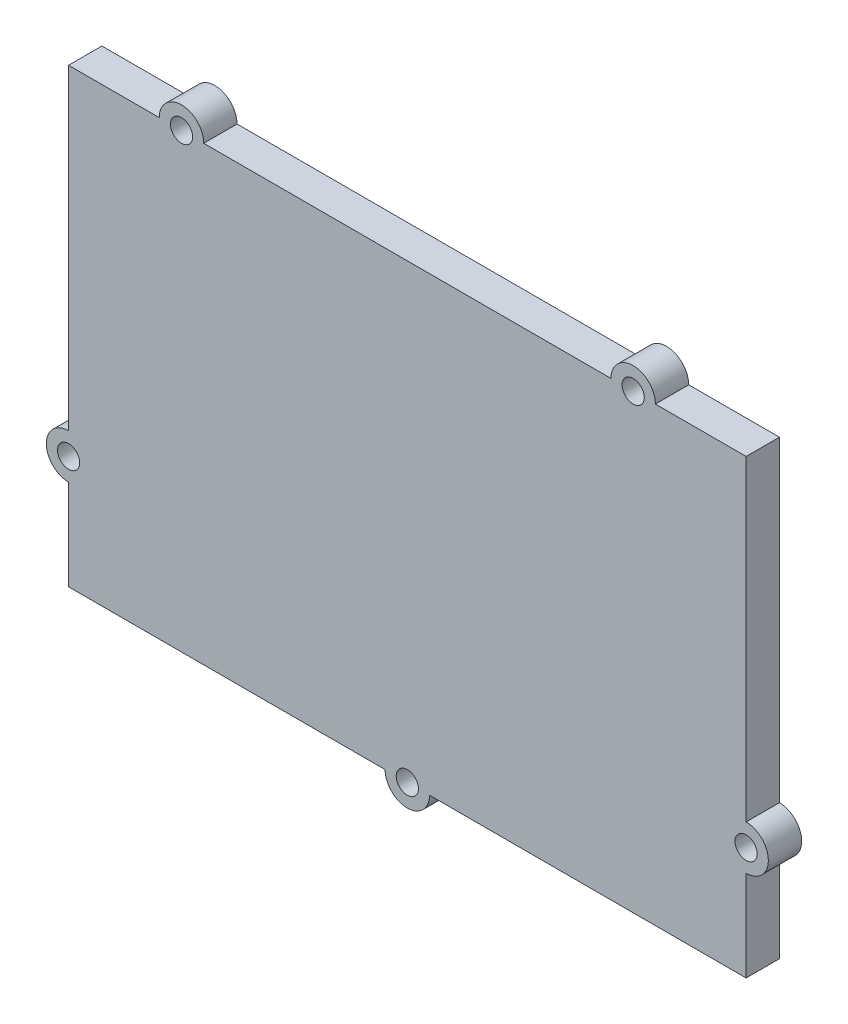
ISO-10303-21;
HEADER;
FILE_DESCRIPTION(('STEP AP214'),'2;1');
FILE_NAME('part.step','',(''),(''),'','','');
FILE_SCHEMA(('AUTOMOTIVE_DESIGN { 1 0 10303 214 1 1 1 1 }'));
ENDSEC;
DATA;
#1=APPLICATION_CONTEXT('core data for automotive mechanical design processes');
#2=APPLICATION_PROTOCOL_DEFINITION('international standard','automotive_design',2000,#1);
#3=PRODUCT_CONTEXT('',#1,'mechanical');
#4=PRODUCT('Part','Part','',(#3));
#5=PRODUCT_RELATED_PRODUCT_CATEGORY('part','',(#4));
#6=PRODUCT_DEFINITION_FORMATION('','',#4);
#7=PRODUCT_DEFINITION_CONTEXT('part definition',#1,'design');
#8=PRODUCT_DEFINITION('design','',#6,#7);
#9=PRODUCT_DEFINITION_SHAPE('','',#8);
#10=(LENGTH_UNIT() NAMED_UNIT(*) SI_UNIT(.MILLI.,.METRE.));
#11=(NAMED_UNIT(*) PLANE_ANGLE_UNIT() SI_UNIT($,.RADIAN.));
#12=(NAMED_UNIT(*) SI_UNIT($,.STERADIAN.) SOLID_ANGLE_UNIT());
#13=UNCERTAINTY_MEASURE_WITH_UNIT(LENGTH_MEASURE(1.E-05),#10,'distance_accuracy_value','');
#14=(GEOMETRIC_REPRESENTATION_CONTEXT(3) GLOBAL_UNCERTAINTY_ASSIGNED_CONTEXT((#13)) GLOBAL_UNIT_ASSIGNED_CONTEXT((#10,
#11,#12)) REPRESENTATION_CONTEXT('',''));
#15=CARTESIAN_POINT('',(0.,0.,0.));
#16=DIRECTION('',(0.,0.,1.));
#17=DIRECTION('',(1.,0.,0.));
#18=AXIS2_PLACEMENT_3D('',#15,#16,#17);
#19=CARTESIAN_POINT('',(30.48,0.,3.));
#20=DIRECTION('',(-1.,0.,0.));
#21=DIRECTION('',(0.,-1.,0.));
#22=AXIS2_PLACEMENT_3D('',#19,#20,#21);
#23=PLANE('',#22);
#24=DIRECTION('',(0.,1.,0.));
#25=VECTOR('',#24,1.);
#26=CARTESIAN_POINT('',(30.48,0.,0.));
#27=LINE('',#26,#25);
#28=CARTESIAN_POINT('',(30.48,-20.32,0.));
#29=VERTEX_POINT('',#28);
#30=CARTESIAN_POINT('',(30.48,-12.16,0.));
#31=VERTEX_POINT('',#30);
#32=EDGE_CURVE('E198',#29,#31,#27,.T.);
#33=ORIENTED_EDGE('',*,*,#32,.T.);
#34=DIRECTION('',(0.,0.,-1.));
#35=VECTOR('',#34,1.);
#36=CARTESIAN_POINT('',(30.48,-12.16,3.));
#37=LINE('',#36,#35);
#38=CARTESIAN_POINT('',(30.48,-12.16,3.));
#39=VERTEX_POINT('',#38);
#40=EDGE_CURVE('E11',#39,#31,#37,.T.);
#41=ORIENTED_EDGE('',*,*,#40,.F.);
#42=DIRECTION('',(0.,1.,0.));
#43=VECTOR('',#42,1.);
#44=CARTESIAN_POINT('',(30.48,0.,3.));
#45=LINE('',#44,#43);
#46=CARTESIAN_POINT('',(30.48,-20.32,3.));
#47=VERTEX_POINT('',#46);
#48=EDGE_CURVE('E331',#47,#39,#45,.T.);
#49=ORIENTED_EDGE('',*,*,#48,.F.);
#50=DIRECTION('',(0.,0.,-1.));
#51=VECTOR('',#50,1.);
#52=CARTESIAN_POINT('',(30.48,-20.32,3.));
#53=LINE('',#52,#51);
#54=EDGE_CURVE('E174',#47,#29,#53,.T.);
#55=ORIENTED_EDGE('',*,*,#54,.T.);
#56=EDGE_LOOP('',(#33,#41,#49,#55));
#57=FACE_BOUND('',#56,.T.);
#58=ADVANCED_FACE('F41',(#57),#23,.F.);
#59=CARTESIAN_POINT('',(30.48,-10.16,3.));
#60=DIRECTION('',(0.,0.,-1.));
#61=DIRECTION('',(-1.,0.,0.));
#62=AXIS2_PLACEMENT_3D('',#59,#60,#61);
#63=CYLINDRICAL_SURFACE('',#62,2.);
#64=CARTESIAN_POINT('',(30.48,-10.16,0.));
#65=DIRECTION('',(0.,0.,1.));
#66=DIRECTION('',(1.,0.,0.));
#67=AXIS2_PLACEMENT_3D('',#64,#65,#66);
#68=CIRCLE('',#67,2.);
#69=CARTESIAN_POINT('',(30.48,-8.16,0.));
#70=VERTEX_POINT('',#69);
#71=EDGE_CURVE('E202',#31,#70,#68,.T.);
#72=ORIENTED_EDGE('',*,*,#71,.T.);
#73=DIRECTION('',(0.,0.,-1.));
#74=VECTOR('',#73,1.);
#75=CARTESIAN_POINT('',(30.48,-8.16,3.));
#76=LINE('',#75,#74);
#77=CARTESIAN_POINT('',(30.48,-8.16,3.));
#78=VERTEX_POINT('',#77);
#79=EDGE_CURVE('E51',#78,#70,#76,.T.);
#80=ORIENTED_EDGE('',*,*,#79,.F.);
#81=CARTESIAN_POINT('',(30.48,-10.16,3.));
#82=DIRECTION('',(0.,0.,1.));
#83=DIRECTION('',(1.,0.,0.));
#84=AXIS2_PLACEMENT_3D('',#81,#82,#83);
#85=CIRCLE('',#84,2.);
#86=EDGE_CURVE('E120',#39,#78,#85,.T.);
#87=ORIENTED_EDGE('',*,*,#86,.F.);
#88=ORIENTED_EDGE('',*,*,#40,.T.);
#89=EDGE_LOOP('',(#72,#80,#87,#88));
#90=FACE_BOUND('',#89,.T.);
#91=ADVANCED_FACE('F346',(#90),#63,.T.);
#92=CARTESIAN_POINT('',(30.48,0.,3.));
#93=DIRECTION('',(-1.,0.,0.));
#94=DIRECTION('',(0.,-1.,0.));
#95=AXIS2_PLACEMENT_3D('',#92,#93,#94);
#96=PLANE('',#95);
#97=DIRECTION('',(0.,1.,0.));
#98=VECTOR('',#97,1.);
#99=CARTESIAN_POINT('',(30.48,0.,0.));
#100=LINE('',#99,#98);
#101=CARTESIAN_POINT('',(30.48,20.32,0.));
#102=VERTEX_POINT('',#101);
#103=EDGE_CURVE('E205',#70,#102,#100,.T.);
#104=ORIENTED_EDGE('',*,*,#103,.T.);
#105=DIRECTION('',(0.,0.,-1.));
#106=VECTOR('',#105,1.);
#107=CARTESIAN_POINT('',(30.48,20.32,3.));
#108=LINE('',#107,#106);
#109=CARTESIAN_POINT('',(30.48,20.32,3.));
#110=VERTEX_POINT('',#109);
#111=EDGE_CURVE('E275',#110,#102,#108,.T.);
#112=ORIENTED_EDGE('',*,*,#111,.F.);
#113=DIRECTION('',(0.,1.,0.));
#114=VECTOR('',#113,1.);
#115=CARTESIAN_POINT('',(30.48,0.,3.));
#116=LINE('',#115,#114);
#117=EDGE_CURVE('E284',#78,#110,#116,.T.);
#118=ORIENTED_EDGE('',*,*,#117,.F.);
#119=ORIENTED_EDGE('',*,*,#79,.T.);
#120=EDGE_LOOP('',(#104,#112,#118,#119));
#121=FACE_BOUND('',#120,.T.);
#122=ADVANCED_FACE('F282',(#121),#96,.F.);
#123=CARTESIAN_POINT('',(0.,20.32,3.));
#124=DIRECTION('',(0.,1.,0.));
#125=DIRECTION('',(0.,0.,1.));
#126=AXIS2_PLACEMENT_3D('',#123,#124,#125);
#127=PLANE('',#126);
#128=DIRECTION('',(1.,0.,0.));
#129=VECTOR('',#128,1.);
#130=CARTESIAN_POINT('',(0.,20.32,0.));
#131=LINE('',#130,#129);
#132=CARTESIAN_POINT('',(22.32,20.32,0.));
#133=VERTEX_POINT('',#132);
#134=EDGE_CURVE('E209',#133,#102,#131,.T.);
#135=ORIENTED_EDGE('',*,*,#134,.F.);
#136=DIRECTION('',(0.,0.,-1.));
#137=VECTOR('',#136,1.);
#138=CARTESIAN_POINT('',(22.32,20.32,3.));
#139=LINE('',#138,#137);
#140=CARTESIAN_POINT('',(22.32,20.32,3.));
#141=VERTEX_POINT('',#140);
#142=EDGE_CURVE('E272',#141,#133,#139,.T.);
#143=ORIENTED_EDGE('',*,*,#142,.F.);
#144=DIRECTION('',(1.,0.,0.));
#145=VECTOR('',#144,1.);
#146=CARTESIAN_POINT('',(0.,20.32,3.));
#147=LINE('',#146,#145);
#148=EDGE_CURVE('E295',#141,#110,#147,.T.);
#149=ORIENTED_EDGE('',*,*,#148,.T.);
#150=ORIENTED_EDGE('',*,*,#111,.T.);
#151=EDGE_LOOP('',(#135,#143,#149,#150));
#152=FACE_BOUND('',#151,.T.);
#153=ADVANCED_FACE('F291',(#152),#127,.T.);
#154=CARTESIAN_POINT('',(20.32,20.32,3.));
#155=DIRECTION('',(0.,0.,-1.));
#156=DIRECTION('',(-1.,0.,0.));
#157=AXIS2_PLACEMENT_3D('',#154,#155,#156);
#158=CYLINDRICAL_SURFACE('',#157,2.);
#159=CARTESIAN_POINT('',(20.32,20.32,0.));
#160=DIRECTION('',(0.,0.,1.));
#161=DIRECTION('',(1.,0.,0.));
#162=AXIS2_PLACEMENT_3D('',#159,#160,#161);
#163=CIRCLE('',#162,2.);
#164=CARTESIAN_POINT('',(18.32,20.32,0.));
#165=VERTEX_POINT('',#164);
#166=EDGE_CURVE('E213',#133,#165,#163,.T.);
#167=ORIENTED_EDGE('',*,*,#166,.T.);
#168=DIRECTION('',(0.,0.,-1.));
#169=VECTOR('',#168,1.);
#170=CARTESIAN_POINT('',(18.32,20.32,3.));
#171=LINE('',#170,#169);
#172=CARTESIAN_POINT('',(18.32,20.32,3.));
#173=VERTEX_POINT('',#172);
#174=EDGE_CURVE('E269',#173,#165,#171,.T.);
#175=ORIENTED_EDGE('',*,*,#174,.F.);
#176=CARTESIAN_POINT('',(20.32,20.32,3.));
#177=DIRECTION('',(0.,0.,1.));
#178=DIRECTION('',(1.,0.,0.));
#179=AXIS2_PLACEMENT_3D('',#176,#177,#178);
#180=CIRCLE('',#179,2.);
#181=EDGE_CURVE('E297',#141,#173,#180,.T.);
#182=ORIENTED_EDGE('',*,*,#181,.F.);
#183=ORIENTED_EDGE('',*,*,#142,.T.);
#184=EDGE_LOOP('',(#167,#175,#182,#183));
#185=FACE_BOUND('',#184,.T.);
#186=ADVANCED_FACE('F502',(#185),#158,.T.);
#187=CARTESIAN_POINT('',(0.,20.32,3.));
#188=DIRECTION('',(0.,1.,0.));
#189=DIRECTION('',(-1.,0.,0.));
#190=AXIS2_PLACEMENT_3D('',#187,#188,#189);
#191=PLANE('',#190);
#192=DIRECTION('',(1.,0.,0.));
#193=VECTOR('',#192,1.);
#194=CARTESIAN_POINT('',(0.,20.32,0.));
#195=LINE('',#194,#193);
#196=CARTESIAN_POINT('',(-18.32,20.32,0.));
#197=VERTEX_POINT('',#196);
#198=EDGE_CURVE('E217',#197,#165,#195,.T.);
#199=ORIENTED_EDGE('',*,*,#198,.F.);
#200=DIRECTION('',(0.,0.,-1.));
#201=VECTOR('',#200,1.);
#202=CARTESIAN_POINT('',(-18.32,20.32,3.));
#203=LINE('',#202,#201);
#204=CARTESIAN_POINT('',(-18.32,20.32,3.));
#205=VERTEX_POINT('',#204);
#206=EDGE_CURVE('E266',#205,#197,#203,.T.);
#207=ORIENTED_EDGE('',*,*,#206,.F.);
#208=DIRECTION('',(1.,0.,0.));
#209=VECTOR('',#208,1.);
#210=CARTESIAN_POINT('',(0.,20.32,3.));
#211=LINE('',#210,#209);
#212=EDGE_CURVE('E301',#205,#173,#211,.T.);
#213=ORIENTED_EDGE('',*,*,#212,.T.);
#214=ORIENTED_EDGE('',*,*,#174,.T.);
#215=EDGE_LOOP('',(#199,#207,#213,#214));
#216=FACE_BOUND('',#215,.T.);
#217=ADVANCED_FACE('F492',(#216),#191,.T.);
#218=CARTESIAN_POINT('',(-20.32,20.32,3.));
#219=DIRECTION('',(0.,0.,-1.));
#220=DIRECTION('',(-1.,0.,0.));
#221=AXIS2_PLACEMENT_3D('',#218,#219,#220);
#222=CYLINDRICAL_SURFACE('',#221,2.);
#223=CARTESIAN_POINT('',(-20.32,20.32,0.));
#224=DIRECTION('',(0.,0.,1.));
#225=DIRECTION('',(1.,0.,0.));
#226=AXIS2_PLACEMENT_3D('',#223,#224,#225);
#227=CIRCLE('',#226,2.);
#228=CARTESIAN_POINT('',(-22.32,20.32,0.));
#229=VERTEX_POINT('',#228);
#230=EDGE_CURVE('E221',#197,#229,#227,.T.);
#231=ORIENTED_EDGE('',*,*,#230,.T.);
#232=DIRECTION('',(0.,0.,-1.));
#233=VECTOR('',#232,1.);
#234=CARTESIAN_POINT('',(-22.32,20.32,3.));
#235=LINE('',#234,#233);
#236=CARTESIAN_POINT('',(-22.32,20.32,3.));
#237=VERTEX_POINT('',#236);
#238=EDGE_CURVE('E263',#237,#229,#235,.T.);
#239=ORIENTED_EDGE('',*,*,#238,.F.);
#240=CARTESIAN_POINT('',(-20.32,20.32,3.));
#241=DIRECTION('',(0.,0.,1.));
#242=DIRECTION('',(1.,0.,0.));
#243=AXIS2_PLACEMENT_3D('',#240,#241,#242);
#244=CIRCLE('',#243,2.);
#245=EDGE_CURVE('E309',#205,#237,#244,.T.);
#246=ORIENTED_EDGE('',*,*,#245,.F.);
#247=ORIENTED_EDGE('',*,*,#206,.T.);
#248=EDGE_LOOP('',(#231,#239,#246,#247));
#249=FACE_BOUND('',#248,.T.);
#250=ADVANCED_FACE('F482',(#249),#222,.T.);
#251=CARTESIAN_POINT('',(0.,20.32,3.));
#252=DIRECTION('',(0.,1.,0.));
#253=DIRECTION('',(0.,0.,1.));
#254=AXIS2_PLACEMENT_3D('',#251,#252,#253);
#255=PLANE('',#254);
#256=DIRECTION('',(1.,0.,0.));
#257=VECTOR('',#256,1.);
#258=CARTESIAN_POINT('',(0.,20.32,0.));
#259=LINE('',#258,#257);
#260=CARTESIAN_POINT('',(-30.48,20.32,0.));
#261=VERTEX_POINT('',#260);
#262=EDGE_CURVE('E225',#261,#229,#259,.T.);
#263=ORIENTED_EDGE('',*,*,#262,.F.);
#264=DIRECTION('',(0.,0.,-1.));
#265=VECTOR('',#264,1.);
#266=CARTESIAN_POINT('',(-30.48,20.32,3.));
#267=LINE('',#266,#265);
#268=CARTESIAN_POINT('',(-30.48,20.32,3.));
#269=VERTEX_POINT('',#268);
#270=EDGE_CURVE('E260',#269,#261,#267,.T.);
#271=ORIENTED_EDGE('',*,*,#270,.F.);
#272=DIRECTION('',(1.,0.,0.));
#273=VECTOR('',#272,1.);
#274=CARTESIAN_POINT('',(0.,20.32,3.));
#275=LINE('',#274,#273);
#276=EDGE_CURVE('E312',#269,#237,#275,.T.);
#277=ORIENTED_EDGE('',*,*,#276,.T.);
#278=ORIENTED_EDGE('',*,*,#238,.T.);
#279=EDGE_LOOP('',(#263,#271,#277,#278));
#280=FACE_BOUND('',#279,.T.);
#281=ADVANCED_FACE('F472',(#280),#255,.T.);
#282=CARTESIAN_POINT('',(-30.48,0.,3.));
#283=DIRECTION('',(-1.,0.,0.));
#284=DIRECTION('',(0.,0.,1.));
#285=AXIS2_PLACEMENT_3D('',#282,#283,#284);
#286=PLANE('',#285);
#287=DIRECTION('',(0.,1.,0.));
#288=VECTOR('',#287,1.);
#289=CARTESIAN_POINT('',(-30.48,0.,0.));
#290=LINE('',#289,#288);
#291=CARTESIAN_POINT('',(-30.48,-8.16,0.));
#292=VERTEX_POINT('',#291);
#293=EDGE_CURVE('E229',#292,#261,#290,.T.);
#294=ORIENTED_EDGE('',*,*,#293,.F.);
#295=DIRECTION('',(0.,0.,-1.));
#296=VECTOR('',#295,1.);
#297=CARTESIAN_POINT('',(-30.48,-8.16,3.));
#298=LINE('',#297,#296);
#299=CARTESIAN_POINT('',(-30.48,-8.16,3.));
#300=VERTEX_POINT('',#299);
#301=EDGE_CURVE('E257',#300,#292,#298,.T.);
#302=ORIENTED_EDGE('',*,*,#301,.F.);
#303=DIRECTION('',(0.,1.,0.));
#304=VECTOR('',#303,1.);
#305=CARTESIAN_POINT('',(-30.48,0.,3.));
#306=LINE('',#305,#304);
#307=EDGE_CURVE('E316',#300,#269,#306,.T.);
#308=ORIENTED_EDGE('',*,*,#307,.T.);
#309=ORIENTED_EDGE('',*,*,#270,.T.);
#310=EDGE_LOOP('',(#294,#302,#308,#309));
#311=FACE_BOUND('',#310,.T.);
#312=ADVANCED_FACE('F462',(#311),#286,.T.);
#313=CARTESIAN_POINT('',(-30.48,-10.16,3.));
#314=DIRECTION('',(0.,0.,-1.));
#315=DIRECTION('',(-1.,0.,0.));
#316=AXIS2_PLACEMENT_3D('',#313,#314,#315);
#317=CYLINDRICAL_SURFACE('',#316,2.);
#318=CARTESIAN_POINT('',(-30.48,-10.16,0.));
#319=DIRECTION('',(0.,0.,1.));
#320=DIRECTION('',(1.,0.,0.));
#321=AXIS2_PLACEMENT_3D('',#318,#319,#320);
#322=CIRCLE('',#321,2.);
#323=CARTESIAN_POINT('',(-30.48,-12.16,0.));
#324=VERTEX_POINT('',#323);
#325=EDGE_CURVE('E233',#292,#324,#322,.T.);
#326=ORIENTED_EDGE('',*,*,#325,.T.);
#327=DIRECTION('',(0.,0.,-1.));
#328=VECTOR('',#327,1.);
#329=CARTESIAN_POINT('',(-30.48,-12.16,3.));
#330=LINE('',#329,#328);
#331=CARTESIAN_POINT('',(-30.48,-12.16,3.));
#332=VERTEX_POINT('',#331);
#333=EDGE_CURVE('E254',#332,#324,#330,.T.);
#334=ORIENTED_EDGE('',*,*,#333,.F.);
#335=CARTESIAN_POINT('',(-30.48,-10.16,3.));
#336=DIRECTION('',(0.,0.,1.));
#337=DIRECTION('',(1.,0.,0.));
#338=AXIS2_PLACEMENT_3D('',#335,#336,#337);
#339=CIRCLE('',#338,2.);
#340=EDGE_CURVE('E320',#300,#332,#339,.T.);
#341=ORIENTED_EDGE('',*,*,#340,.F.);
#342=ORIENTED_EDGE('',*,*,#301,.T.);
#343=EDGE_LOOP('',(#326,#334,#341,#342));
#344=FACE_BOUND('',#343,.T.);
#345=ADVANCED_FACE('F453',(#344),#317,.T.);
#346=CARTESIAN_POINT('',(-30.48,0.,3.));
#347=DIRECTION('',(-1.,0.,0.));
#348=DIRECTION('',(0.,0.,1.));
#349=AXIS2_PLACEMENT_3D('',#346,#347,#348);
#350=PLANE('',#349);
#351=DIRECTION('',(0.,1.,0.));
#352=VECTOR('',#351,1.);
#353=CARTESIAN_POINT('',(-30.48,0.,0.));
#354=LINE('',#353,#352);
#355=CARTESIAN_POINT('',(-30.48,-20.32,0.));
#356=VERTEX_POINT('',#355);
#357=EDGE_CURVE('E237',#356,#324,#354,.T.);
#358=ORIENTED_EDGE('',*,*,#357,.F.);
#359=DIRECTION('',(0.,0.,-1.));
#360=VECTOR('',#359,1.);
#361=CARTESIAN_POINT('',(-30.48,-20.32,3.));
#362=LINE('',#361,#360);
#363=CARTESIAN_POINT('',(-30.48,-20.32,3.));
#364=VERTEX_POINT('',#363);
#365=EDGE_CURVE('E167',#364,#356,#362,.T.);
#366=ORIENTED_EDGE('',*,*,#365,.F.);
#367=DIRECTION('',(0.,1.,0.));
#368=VECTOR('',#367,1.);
#369=CARTESIAN_POINT('',(-30.48,0.,3.));
#370=LINE('',#369,#368);
#371=EDGE_CURVE('E158',#364,#332,#370,.T.);
#372=ORIENTED_EDGE('',*,*,#371,.T.);
#373=ORIENTED_EDGE('',*,*,#333,.T.);
#374=EDGE_LOOP('',(#358,#366,#372,#373));
#375=FACE_BOUND('',#374,.T.);
#376=ADVANCED_FACE('F325',(#375),#350,.T.);
#377=CARTESIAN_POINT('',(0.,-20.32,3.));
#378=DIRECTION('',(0.,1.,0.));
#379=DIRECTION('',(0.,0.,1.));
#380=AXIS2_PLACEMENT_3D('',#377,#378,#379);
#381=PLANE('',#380);
#382=DIRECTION('',(1.,0.,0.));
#383=VECTOR('',#382,1.);
#384=CARTESIAN_POINT('',(0.,-20.32,0.));
#385=LINE('',#384,#383);
#386=CARTESIAN_POINT('',(-1.99999999999998,-20.32,0.));
#387=VERTEX_POINT('',#386);
#388=EDGE_CURVE('E165',#356,#387,#385,.T.);
#389=ORIENTED_EDGE('',*,*,#388,.T.);
#390=DIRECTION('',(0.,0.,-1.));
#391=VECTOR('',#390,1.);
#392=CARTESIAN_POINT('',(-1.99999999999998,-20.32,3.));
#393=LINE('',#392,#391);
#394=CARTESIAN_POINT('',(-1.99999999999998,-20.32,3.));
#395=VERTEX_POINT('',#394);
#396=EDGE_CURVE('E162',#395,#387,#393,.T.);
#397=ORIENTED_EDGE('',*,*,#396,.F.);
#398=DIRECTION('',(1.,0.,0.));
#399=VECTOR('',#398,1.);
#400=CARTESIAN_POINT('',(0.,-20.32,3.));
#401=LINE('',#400,#399);
#402=EDGE_CURVE('E152',#364,#395,#401,.T.);
#403=ORIENTED_EDGE('',*,*,#402,.F.);
#404=ORIENTED_EDGE('',*,*,#365,.T.);
#405=EDGE_LOOP('',(#389,#397,#403,#404));
#406=FACE_BOUND('',#405,.T.);
#407=ADVANCED_FACE('F163',(#406),#381,.F.);
#408=CARTESIAN_POINT('',(0.,-20.32,3.));
#409=DIRECTION('',(0.,0.,-1.));
#410=DIRECTION('',(-1.,0.,0.));
#411=AXIS2_PLACEMENT_3D('',#408,#409,#410);
#412=CYLINDRICAL_SURFACE('',#411,2.);
#413=CARTESIAN_POINT('',(0.,-20.32,0.));
#414=DIRECTION('',(0.,0.,1.));
#415=DIRECTION('',(1.,0.,0.));
#416=AXIS2_PLACEMENT_3D('',#413,#414,#415);
#417=CIRCLE('',#416,2.);
#418=CARTESIAN_POINT('',(2.00000000000002,-20.32,0.));
#419=VERTEX_POINT('',#418);
#420=EDGE_CURVE('E106',#387,#419,#417,.T.);
#421=ORIENTED_EDGE('',*,*,#420,.T.);
#422=DIRECTION('',(0.,0.,-1.));
#423=VECTOR('',#422,1.);
#424=CARTESIAN_POINT('',(2.00000000000002,-20.32,3.));
#425=LINE('',#424,#423);
#426=CARTESIAN_POINT('',(2.00000000000002,-20.32,3.));
#427=VERTEX_POINT('',#426);
#428=EDGE_CURVE('E168',#427,#419,#425,.T.);
#429=ORIENTED_EDGE('',*,*,#428,.F.);
#430=CARTESIAN_POINT('',(0.,-20.32,3.));
#431=DIRECTION('',(0.,0.,1.));
#432=DIRECTION('',(1.,0.,0.));
#433=AXIS2_PLACEMENT_3D('',#430,#431,#432);
#434=CIRCLE('',#433,2.);
#435=EDGE_CURVE('E156',#395,#427,#434,.T.);
#436=ORIENTED_EDGE('',*,*,#435,.F.);
#437=ORIENTED_EDGE('',*,*,#396,.T.);
#438=EDGE_LOOP('',(#421,#429,#436,#437));
#439=FACE_BOUND('',#438,.T.);
#440=ADVANCED_FACE('F170',(#439),#412,.T.);
#441=CARTESIAN_POINT('',(-20.32,20.32,3.));
#442=DIRECTION('',(0.,0.,-1.));
#443=DIRECTION('',(-1.,0.,0.));
#444=AXIS2_PLACEMENT_3D('',#441,#442,#443);
#445=CYLINDRICAL_SURFACE('',#444,1.);
#446=CARTESIAN_POINT('',(-20.32,20.32,3.));
#447=DIRECTION('',(0.,0.,1.));
#448=DIRECTION('',(1.,0.,0.));
#449=AXIS2_PLACEMENT_3D('',#446,#447,#448);
#450=CIRCLE('',#449,1.);
#451=CARTESIAN_POINT('',(-19.32,20.32,3.));
#452=VERTEX_POINT('',#451);
#453=EDGE_CURVE('E626',#452,#452,#450,.T.);
#454=ORIENTED_EDGE('',*,*,#453,.T.);
#455=EDGE_LOOP('',(#454));
#456=FACE_BOUND('',#455,.T.);
#457=CARTESIAN_POINT('',(-20.32,20.32,0.));
#458=DIRECTION('',(0.,0.,1.));
#459=DIRECTION('',(1.,0.,0.));
#460=AXIS2_PLACEMENT_3D('',#457,#458,#459);
#461=CIRCLE('',#460,1.);
#462=CARTESIAN_POINT('',(-19.32,20.32,0.));
#463=VERTEX_POINT('',#462);
#464=EDGE_CURVE('E194',#463,#463,#461,.T.);
#465=ORIENTED_EDGE('',*,*,#464,.F.);
#466=EDGE_LOOP('',(#465));
#467=FACE_BOUND('',#466,.T.);
#468=ADVANCED_FACE('F354',(#456,#467),#445,.F.);
#469=CARTESIAN_POINT('',(20.32,20.32,3.));
#470=DIRECTION('',(0.,0.,-1.));
#471=DIRECTION('',(-1.,0.,0.));
#472=AXIS2_PLACEMENT_3D('',#469,#470,#471);
#473=CYLINDRICAL_SURFACE('',#472,1.);
#474=CARTESIAN_POINT('',(20.32,20.32,3.));
#475=DIRECTION('',(0.,0.,1.));
#476=DIRECTION('',(1.,0.,0.));
#477=AXIS2_PLACEMENT_3D('',#474,#475,#476);
#478=CIRCLE('',#477,1.);
#479=CARTESIAN_POINT('',(21.32,20.32,3.));
#480=VERTEX_POINT('',#479);
#481=EDGE_CURVE('E618',#480,#480,#478,.T.);
#482=ORIENTED_EDGE('',*,*,#481,.T.);
#483=EDGE_LOOP('',(#482));
#484=FACE_BOUND('',#483,.T.);
#485=CARTESIAN_POINT('',(20.32,20.32,0.));
#486=DIRECTION('',(0.,0.,1.));
#487=DIRECTION('',(1.,0.,0.));
#488=AXIS2_PLACEMENT_3D('',#485,#486,#487);
#489=CIRCLE('',#488,1.);
#490=CARTESIAN_POINT('',(21.32,20.32,0.));
#491=VERTEX_POINT('',#490);
#492=EDGE_CURVE('E190',#491,#491,#489,.T.);
#493=ORIENTED_EDGE('',*,*,#492,.F.);
#494=EDGE_LOOP('',(#493));
#495=FACE_BOUND('',#494,.T.);
#496=ADVANCED_FACE('F357',(#484,#495),#473,.F.);
#497=CARTESIAN_POINT('',(30.48,-10.16,3.));
#498=DIRECTION('',(0.,0.,-1.));
#499=DIRECTION('',(-1.,0.,0.));
#500=AXIS2_PLACEMENT_3D('',#497,#498,#499);
#501=CYLINDRICAL_SURFACE('',#500,0.999999999999994);
#502=CARTESIAN_POINT('',(30.48,-10.16,3.));
#503=DIRECTION('',(0.,0.,1.));
#504=DIRECTION('',(1.,0.,0.));
#505=AXIS2_PLACEMENT_3D('',#502,#503,#504);
#506=CIRCLE('',#505,0.999999999999994);
#507=CARTESIAN_POINT('',(31.48,-10.16,3.));
#508=VERTEX_POINT('',#507);
#509=EDGE_CURVE('E613',#508,#508,#506,.T.);
#510=ORIENTED_EDGE('',*,*,#509,.T.);
#511=EDGE_LOOP('',(#510));
#512=FACE_BOUND('',#511,.T.);
#513=CARTESIAN_POINT('',(30.48,-10.16,0.));
#514=DIRECTION('',(0.,0.,1.));
#515=DIRECTION('',(1.,0.,0.));
#516=AXIS2_PLACEMENT_3D('',#513,#514,#515);
#517=CIRCLE('',#516,0.999999999999994);
#518=CARTESIAN_POINT('',(31.48,-10.16,0.));
#519=VERTEX_POINT('',#518);
#520=EDGE_CURVE('E186',#519,#519,#517,.T.);
#521=ORIENTED_EDGE('',*,*,#520,.F.);
#522=EDGE_LOOP('',(#521));
#523=FACE_BOUND('',#522,.T.);
#524=ADVANCED_FACE('F361',(#512,#523),#501,.F.);
#525=CARTESIAN_POINT('',(0.,-20.32,3.));
#526=DIRECTION('',(0.,0.,-1.));
#527=DIRECTION('',(-1.,0.,0.));
#528=AXIS2_PLACEMENT_3D('',#525,#526,#527);
#529=CYLINDRICAL_SURFACE('',#528,1.);
#530=CARTESIAN_POINT('',(0.,-20.32,3.));
#531=DIRECTION('',(0.,0.,1.));
#532=DIRECTION('',(1.,0.,0.));
#533=AXIS2_PLACEMENT_3D('',#530,#531,#532);
#534=CIRCLE('',#533,1.);
#535=CARTESIAN_POINT('',(1.00000000000002,-20.32,3.));
#536=VERTEX_POINT('',#535);
#537=EDGE_CURVE('E372',#536,#536,#534,.T.);
#538=ORIENTED_EDGE('',*,*,#537,.T.);
#539=EDGE_LOOP('',(#538));
#540=FACE_BOUND('',#539,.T.);
#541=CARTESIAN_POINT('',(0.,-20.32,0.));
#542=DIRECTION('',(0.,0.,1.));
#543=DIRECTION('',(1.,0.,0.));
#544=AXIS2_PLACEMENT_3D('',#541,#542,#543);
#545=CIRCLE('',#544,1.);
#546=CARTESIAN_POINT('',(1.00000000000002,-20.32,0.));
#547=VERTEX_POINT('',#546);
#548=EDGE_CURVE('E182',#547,#547,#545,.T.);
#549=ORIENTED_EDGE('',*,*,#548,.F.);
#550=EDGE_LOOP('',(#549));
#551=FACE_BOUND('',#550,.T.);
#552=ADVANCED_FACE('F341',(#540,#551),#529,.F.);
#553=CARTESIAN_POINT('',(-30.48,-10.16,3.));
#554=DIRECTION('',(0.,0.,-1.));
#555=DIRECTION('',(-1.,0.,0.));
#556=AXIS2_PLACEMENT_3D('',#553,#554,#555);
#557=CYLINDRICAL_SURFACE('',#556,1.);
#558=CARTESIAN_POINT('',(-30.48,-10.16,3.));
#559=DIRECTION('',(0.,0.,1.));
#560=DIRECTION('',(1.,0.,0.));
#561=AXIS2_PLACEMENT_3D('',#558,#559,#560);
#562=CIRCLE('',#561,1.);
#563=CARTESIAN_POINT('',(-29.48,-10.16,3.));
#564=VERTEX_POINT('',#563);
#565=EDGE_CURVE('E247',#564,#564,#562,.T.);
#566=ORIENTED_EDGE('',*,*,#565,.T.);
#567=EDGE_LOOP('',(#566));
#568=FACE_BOUND('',#567,.T.);
#569=CARTESIAN_POINT('',(-30.48,-10.16,0.));
#570=DIRECTION('',(0.,0.,1.));
#571=DIRECTION('',(1.,0.,0.));
#572=AXIS2_PLACEMENT_3D('',#569,#570,#571);
#573=CIRCLE('',#572,1.);
#574=CARTESIAN_POINT('',(-29.48,-10.16,0.));
#575=VERTEX_POINT('',#574);
#576=EDGE_CURVE('E178',#575,#575,#573,.T.);
#577=ORIENTED_EDGE('',*,*,#576,.F.);
#578=EDGE_LOOP('',(#577));
#579=FACE_BOUND('',#578,.T.);
#580=ADVANCED_FACE('F43',(#568,#579),#557,.F.);
#581=CARTESIAN_POINT('',(0.,-20.32,3.));
#582=DIRECTION('',(0.,1.,0.));
#583=DIRECTION('',(0.,0.,1.));
#584=AXIS2_PLACEMENT_3D('',#581,#582,#583);
#585=PLANE('',#584);
#586=DIRECTION('',(1.,0.,0.));
#587=VECTOR('',#586,1.);
#588=CARTESIAN_POINT('',(0.,-20.32,0.));
#589=LINE('',#588,#587);
#590=EDGE_CURVE('E112',#419,#29,#589,.T.);
#591=ORIENTED_EDGE('',*,*,#590,.T.);
#592=ORIENTED_EDGE('',*,*,#54,.F.);
#593=DIRECTION('',(1.,0.,0.));
#594=VECTOR('',#593,1.);
#595=CARTESIAN_POINT('',(0.,-20.32,3.));
#596=LINE('',#595,#594);
#597=EDGE_CURVE('E59',#427,#47,#596,.T.);
#598=ORIENTED_EDGE('',*,*,#597,.F.);
#599=ORIENTED_EDGE('',*,*,#428,.T.);
#600=EDGE_LOOP('',(#591,#592,#598,#599));
#601=FACE_BOUND('',#600,.T.);
#602=ADVANCED_FACE('F332',(#601),#585,.F.);
#603=CARTESIAN_POINT('',(0.,0.,3.));
#604=DIRECTION('',(0.,0.,1.));
#605=DIRECTION('',(1.,0.,0.));
#606=AXIS2_PLACEMENT_3D('',#603,#604,#605);
#607=PLANE('',#606);
#608=ORIENTED_EDGE('',*,*,#565,.F.);
#609=EDGE_LOOP('',(#608));
#610=FACE_BOUND('',#609,.T.);
#611=ORIENTED_EDGE('',*,*,#537,.F.);
#612=EDGE_LOOP('',(#611));
#613=FACE_BOUND('',#612,.T.);
#614=ORIENTED_EDGE('',*,*,#509,.F.);
#615=EDGE_LOOP('',(#614));
#616=FACE_BOUND('',#615,.T.);
#617=ORIENTED_EDGE('',*,*,#481,.F.);
#618=EDGE_LOOP('',(#617));
#619=FACE_BOUND('',#618,.T.);
#620=ORIENTED_EDGE('',*,*,#453,.F.);
#621=EDGE_LOOP('',(#620));
#622=FACE_BOUND('',#621,.T.);
#623=ORIENTED_EDGE('',*,*,#48,.T.);
#624=ORIENTED_EDGE('',*,*,#86,.T.);
#625=ORIENTED_EDGE('',*,*,#117,.T.);
#626=ORIENTED_EDGE('',*,*,#148,.F.);
#627=ORIENTED_EDGE('',*,*,#181,.T.);
#628=ORIENTED_EDGE('',*,*,#212,.F.);
#629=ORIENTED_EDGE('',*,*,#245,.T.);
#630=ORIENTED_EDGE('',*,*,#276,.F.);
#631=ORIENTED_EDGE('',*,*,#307,.F.);
#632=ORIENTED_EDGE('',*,*,#340,.T.);
#633=ORIENTED_EDGE('',*,*,#371,.F.);
#634=ORIENTED_EDGE('',*,*,#402,.T.);
#635=ORIENTED_EDGE('',*,*,#435,.T.);
#636=ORIENTED_EDGE('',*,*,#597,.T.);
#637=EDGE_LOOP('',(#623,#624,#625,#626,#627,#628,#629,#630,#631,#632,#633,#634,#635,#636));
#638=FACE_BOUND('',#637,.T.);
#639=ADVANCED_FACE('F154',(#610,#613,#616,#619,#622,#638),#607,.T.);
#640=CARTESIAN_POINT('',(0.,0.,0.));
#641=DIRECTION('',(0.,0.,1.));
#642=DIRECTION('',(1.,0.,0.));
#643=AXIS2_PLACEMENT_3D('',#640,#641,#642);
#644=PLANE('',#643);
#645=ORIENTED_EDGE('',*,*,#576,.T.);
#646=EDGE_LOOP('',(#645));
#647=FACE_BOUND('',#646,.T.);
#648=ORIENTED_EDGE('',*,*,#548,.T.);
#649=EDGE_LOOP('',(#648));
#650=FACE_BOUND('',#649,.T.);
#651=ORIENTED_EDGE('',*,*,#520,.T.);
#652=EDGE_LOOP('',(#651));
#653=FACE_BOUND('',#652,.T.);
#654=ORIENTED_EDGE('',*,*,#492,.T.);
#655=EDGE_LOOP('',(#654));
#656=FACE_BOUND('',#655,.T.);
#657=ORIENTED_EDGE('',*,*,#464,.T.);
#658=EDGE_LOOP('',(#657));
#659=FACE_BOUND('',#658,.T.);
#660=ORIENTED_EDGE('',*,*,#32,.F.);
#661=ORIENTED_EDGE('',*,*,#590,.F.);
#662=ORIENTED_EDGE('',*,*,#420,.F.);
#663=ORIENTED_EDGE('',*,*,#388,.F.);
#664=ORIENTED_EDGE('',*,*,#357,.T.);
#665=ORIENTED_EDGE('',*,*,#325,.F.);
#666=ORIENTED_EDGE('',*,*,#293,.T.);
#667=ORIENTED_EDGE('',*,*,#262,.T.);
#668=ORIENTED_EDGE('',*,*,#230,.F.);
#669=ORIENTED_EDGE('',*,*,#198,.T.);
#670=ORIENTED_EDGE('',*,*,#166,.F.);
#671=ORIENTED_EDGE('',*,*,#134,.T.);
#672=ORIENTED_EDGE('',*,*,#103,.F.);
#673=ORIENTED_EDGE('',*,*,#71,.F.);
#674=EDGE_LOOP('',(#660,#661,#662,#663,#664,#665,#666,#667,#668,#669,#670,#671,#672,#673));
#675=FACE_BOUND('',#674,.T.);
#676=ADVANCED_FACE('F287',(#647,#650,#653,#656,#659,#675),#644,.F.);
#677=CLOSED_SHELL('',(#58,#91,#122,#153,#186,#217,#250,#281,#312,#345,#376,#407,#440,#468,#496,
#524,#552,#580,#602,#639,#676));
#678=MANIFOLD_SOLID_BREP('B2',#677);
#679=ADVANCED_BREP_SHAPE_REPRESENTATION('',(#18,#678),#14);
#680=SHAPE_DEFINITION_REPRESENTATION(#9,#679);
ENDSEC;
END-ISO-10303-21;
